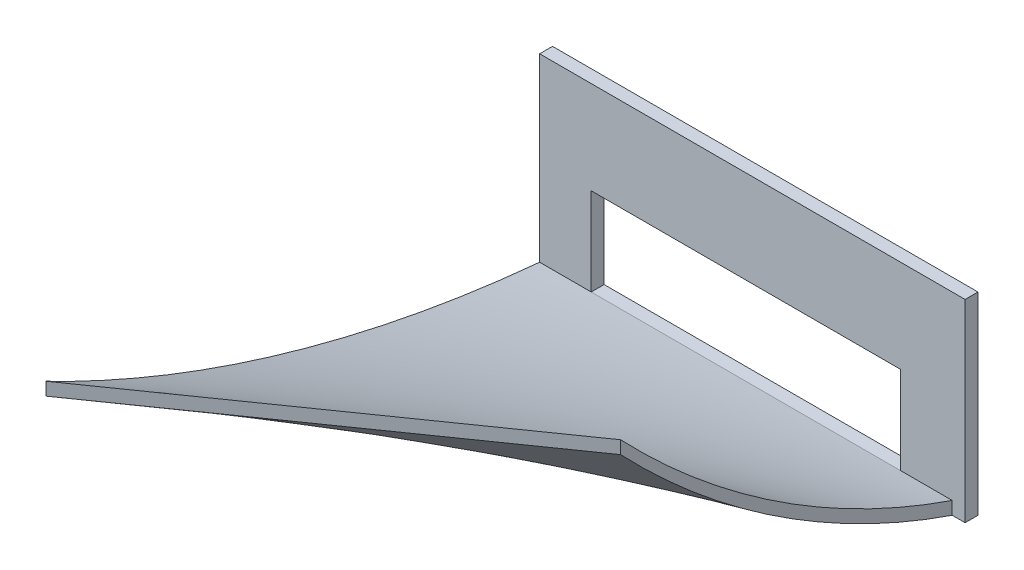
ISO-10303-21;
HEADER;
FILE_DESCRIPTION(('STEP AP214'),'2;1');
FILE_NAME('part.step','',(''),(''),'','','');
FILE_SCHEMA(('AUTOMOTIVE_DESIGN { 1 0 10303 214 1 1 1 1 }'));
ENDSEC;
DATA;
#1=APPLICATION_CONTEXT('core data for automotive mechanical design processes');
#2=APPLICATION_PROTOCOL_DEFINITION('international standard','automotive_design',2000,#1);
#3=PRODUCT_CONTEXT('',#1,'mechanical');
#4=PRODUCT('Part','Part','',(#3));
#5=PRODUCT_RELATED_PRODUCT_CATEGORY('part','',(#4));
#6=PRODUCT_DEFINITION_FORMATION('','',#4);
#7=PRODUCT_DEFINITION_CONTEXT('part definition',#1,'design');
#8=PRODUCT_DEFINITION('design','',#6,#7);
#9=PRODUCT_DEFINITION_SHAPE('','',#8);
#10=(LENGTH_UNIT() NAMED_UNIT(*) SI_UNIT(.MILLI.,.METRE.));
#11=(NAMED_UNIT(*) PLANE_ANGLE_UNIT() SI_UNIT($,.RADIAN.));
#12=(NAMED_UNIT(*) SI_UNIT($,.STERADIAN.) SOLID_ANGLE_UNIT());
#13=UNCERTAINTY_MEASURE_WITH_UNIT(LENGTH_MEASURE(1.E-05),#10,'distance_accuracy_value','');
#14=(GEOMETRIC_REPRESENTATION_CONTEXT(3) GLOBAL_UNCERTAINTY_ASSIGNED_CONTEXT((#13)) GLOBAL_UNIT_ASSIGNED_CONTEXT((#10,
#11,#12)) REPRESENTATION_CONTEXT('',''));
#15=CARTESIAN_POINT('',(0.,0.,0.));
#16=DIRECTION('',(0.,0.,1.));
#17=DIRECTION('',(1.,0.,0.));
#18=AXIS2_PLACEMENT_3D('',#15,#16,#17);
#19=CARTESIAN_POINT('',(-50.8,22.225,3.175));
#20=DIRECTION('',(0.,-1.,0.));
#21=DIRECTION('',(0.,0.,-1.));
#22=AXIS2_PLACEMENT_3D('',#19,#20,#21);
#23=PLANE('',#22);
#24=DIRECTION('',(-1.,0.,0.));
#25=VECTOR('',#24,1.);
#26=CARTESIAN_POINT('',(-50.8,22.225,0.));
#27=LINE('',#26,#25);
#28=CARTESIAN_POINT('',(53.975,22.225,0.));
#29=VERTEX_POINT('',#28);
#30=CARTESIAN_POINT('',(-50.8,22.225,0.));
#31=VERTEX_POINT('',#30);
#32=EDGE_CURVE('E224',#29,#31,#27,.T.);
#33=ORIENTED_EDGE('',*,*,#32,.T.);
#34=DIRECTION('',(0.,0.,-1.));
#35=VECTOR('',#34,1.);
#36=CARTESIAN_POINT('',(-50.8,22.225,3.175));
#37=LINE('',#36,#35);
#38=CARTESIAN_POINT('',(-50.8,22.225,3.175));
#39=VERTEX_POINT('',#38);
#40=EDGE_CURVE('E107',#39,#31,#37,.T.);
#41=ORIENTED_EDGE('',*,*,#40,.F.);
#42=DIRECTION('',(-1.,0.,0.));
#43=VECTOR('',#42,1.);
#44=CARTESIAN_POINT('',(-50.8,22.225,3.175));
#45=LINE('',#44,#43);
#46=CARTESIAN_POINT('',(53.975,22.225,3.175));
#47=VERTEX_POINT('',#46);
#48=EDGE_CURVE('E150',#47,#39,#45,.T.);
#49=ORIENTED_EDGE('',*,*,#48,.F.);
#50=DIRECTION('',(0.,0.,1.));
#51=VECTOR('',#50,1.);
#52=CARTESIAN_POINT('',(53.975,22.225,3.175));
#53=LINE('',#52,#51);
#54=EDGE_CURVE('E324',#29,#47,#53,.T.);
#55=ORIENTED_EDGE('',*,*,#54,.F.);
#56=EDGE_LOOP('',(#33,#41,#49,#55));
#57=FACE_BOUND('',#56,.T.);
#58=ADVANCED_FACE('F97',(#57),#23,.F.);
#59=CARTESIAN_POINT('',(-50.8,-22.225,3.175));
#60=DIRECTION('',(1.,0.,0.));
#61=DIRECTION('',(0.,0.,-1.));
#62=AXIS2_PLACEMENT_3D('',#59,#60,#61);
#63=PLANE('',#62);
#64=DIRECTION('',(0.,-1.,0.));
#65=VECTOR('',#64,1.);
#66=CARTESIAN_POINT('',(-50.8,-22.225,0.));
#67=LINE('',#66,#65);
#68=CARTESIAN_POINT('',(-50.8,-25.4,0.));
#69=VERTEX_POINT('',#68);
#70=EDGE_CURVE('E226',#31,#69,#67,.T.);
#71=ORIENTED_EDGE('',*,*,#70,.T.);
#72=DIRECTION('',(0.,0.,1.));
#73=VECTOR('',#72,1.);
#74=CARTESIAN_POINT('',(-50.8,-25.4,0.));
#75=LINE('',#74,#73);
#76=CARTESIAN_POINT('',(-50.8,-25.4000000000005,3.175));
#77=VERTEX_POINT('',#76);
#78=EDGE_CURVE('E236',#69,#77,#75,.T.);
#79=ORIENTED_EDGE('',*,*,#78,.T.);
#80=DIRECTION('',(0.,-1.,0.));
#81=VECTOR('',#80,1.);
#82=CARTESIAN_POINT('',(-50.8,-25.4,3.175));
#83=LINE('',#82,#81);
#84=CARTESIAN_POINT('',(-50.8,-22.225,3.175));
#85=VERTEX_POINT('',#84);
#86=EDGE_CURVE('E141',#85,#77,#83,.T.);
#87=ORIENTED_EDGE('',*,*,#86,.F.);
#88=DIRECTION('',(0.,-1.,0.));
#89=VECTOR('',#88,1.);
#90=CARTESIAN_POINT('',(-50.8,-22.225,3.175));
#91=LINE('',#90,#89);
#92=EDGE_CURVE('E238',#39,#85,#91,.T.);
#93=ORIENTED_EDGE('',*,*,#92,.F.);
#94=ORIENTED_EDGE('',*,*,#40,.T.);
#95=EDGE_LOOP('',(#71,#79,#87,#93,#94));
#96=FACE_BOUND('',#95,.T.);
#97=ADVANCED_FACE('F284',(#96),#63,.F.);
#98=CARTESIAN_POINT('',(-38.1,-22.225,3.175));
#99=DIRECTION('',(-1.,0.,0.));
#100=DIRECTION('',(0.,0.,1.));
#101=AXIS2_PLACEMENT_3D('',#98,#99,#100);
#102=PLANE('',#101);
#103=DIRECTION('',(0.,1.,0.));
#104=VECTOR('',#103,1.);
#105=CARTESIAN_POINT('',(-38.1,-22.225,0.));
#106=LINE('',#105,#104);
#107=CARTESIAN_POINT('',(-38.1,-22.225,0.));
#108=VERTEX_POINT('',#107);
#109=CARTESIAN_POINT('',(-38.1,-0.635000000000004,0.));
#110=VERTEX_POINT('',#109);
#111=EDGE_CURVE('E222',#108,#110,#106,.T.);
#112=ORIENTED_EDGE('',*,*,#111,.T.);
#113=DIRECTION('',(0.,0.,-1.));
#114=VECTOR('',#113,1.);
#115=CARTESIAN_POINT('',(-38.1,-0.635000000000004,3.175));
#116=LINE('',#115,#114);
#117=CARTESIAN_POINT('',(-38.1,-0.635000000000004,3.175));
#118=VERTEX_POINT('',#117);
#119=EDGE_CURVE('E248',#118,#110,#116,.T.);
#120=ORIENTED_EDGE('',*,*,#119,.F.);
#121=DIRECTION('',(0.,1.,0.));
#122=VECTOR('',#121,1.);
#123=CARTESIAN_POINT('',(-38.1,-22.225,3.175));
#124=LINE('',#123,#122);
#125=CARTESIAN_POINT('',(-38.1,-22.225,3.175));
#126=VERTEX_POINT('',#125);
#127=EDGE_CURVE('E241',#126,#118,#124,.T.);
#128=ORIENTED_EDGE('',*,*,#127,.F.);
#129=DIRECTION('',(0.,0.,-1.));
#130=VECTOR('',#129,1.);
#131=CARTESIAN_POINT('',(-38.1,-22.225,3.175));
#132=LINE('',#131,#130);
#133=EDGE_CURVE('E250',#126,#108,#132,.T.);
#134=ORIENTED_EDGE('',*,*,#133,.T.);
#135=EDGE_LOOP('',(#112,#120,#128,#134));
#136=FACE_BOUND('',#135,.T.);
#137=ADVANCED_FACE('F282',(#136),#102,.F.);
#138=CARTESIAN_POINT('',(-38.1,-0.635000000000004,3.175));
#139=DIRECTION('',(0.,1.,0.));
#140=DIRECTION('',(-1.,0.,0.));
#141=AXIS2_PLACEMENT_3D('',#138,#139,#140);
#142=PLANE('',#141);
#143=DIRECTION('',(1.,0.,0.));
#144=VECTOR('',#143,1.);
#145=CARTESIAN_POINT('',(-38.1,-0.635000000000004,0.));
#146=LINE('',#145,#144);
#147=CARTESIAN_POINT('',(38.1,-0.634999999999995,0.));
#148=VERTEX_POINT('',#147);
#149=EDGE_CURVE('E194',#110,#148,#146,.T.);
#150=ORIENTED_EDGE('',*,*,#149,.T.);
#151=DIRECTION('',(0.,0.,-1.));
#152=VECTOR('',#151,1.);
#153=CARTESIAN_POINT('',(38.1,-0.634999999999995,3.175));
#154=LINE('',#153,#152);
#155=CARTESIAN_POINT('',(38.1,-0.634999999999995,3.175));
#156=VERTEX_POINT('',#155);
#157=EDGE_CURVE('E206',#156,#148,#154,.T.);
#158=ORIENTED_EDGE('',*,*,#157,.F.);
#159=DIRECTION('',(1.,0.,0.));
#160=VECTOR('',#159,1.);
#161=CARTESIAN_POINT('',(-38.1,-0.635000000000004,3.175));
#162=LINE('',#161,#160);
#163=EDGE_CURVE('E242',#118,#156,#162,.T.);
#164=ORIENTED_EDGE('',*,*,#163,.F.);
#165=ORIENTED_EDGE('',*,*,#119,.T.);
#166=EDGE_LOOP('',(#150,#158,#164,#165));
#167=FACE_BOUND('',#166,.T.);
#168=ADVANCED_FACE('F279',(#167),#142,.F.);
#169=CARTESIAN_POINT('',(38.1,-22.225,3.175));
#170=DIRECTION('',(1.,0.,0.));
#171=DIRECTION('',(0.,0.,-1.));
#172=AXIS2_PLACEMENT_3D('',#169,#170,#171);
#173=PLANE('',#172);
#174=DIRECTION('',(0.,-1.,0.));
#175=VECTOR('',#174,1.);
#176=CARTESIAN_POINT('',(38.1,-22.225,0.));
#177=LINE('',#176,#175);
#178=CARTESIAN_POINT('',(38.1,-22.225,0.));
#179=VERTEX_POINT('',#178);
#180=EDGE_CURVE('E200',#148,#179,#177,.T.);
#181=ORIENTED_EDGE('',*,*,#180,.T.);
#182=DIRECTION('',(0.,0.,-1.));
#183=VECTOR('',#182,1.);
#184=CARTESIAN_POINT('',(38.1,-22.225,3.175));
#185=LINE('',#184,#183);
#186=CARTESIAN_POINT('',(38.1,-22.225,3.175));
#187=VERTEX_POINT('',#186);
#188=EDGE_CURVE('E204',#187,#179,#185,.T.);
#189=ORIENTED_EDGE('',*,*,#188,.F.);
#190=DIRECTION('',(0.,-1.,0.));
#191=VECTOR('',#190,1.);
#192=CARTESIAN_POINT('',(38.1,-22.225,3.175));
#193=LINE('',#192,#191);
#194=EDGE_CURVE('E218',#156,#187,#193,.T.);
#195=ORIENTED_EDGE('',*,*,#194,.F.);
#196=ORIENTED_EDGE('',*,*,#157,.T.);
#197=EDGE_LOOP('',(#181,#189,#195,#196));
#198=FACE_BOUND('',#197,.T.);
#199=ADVANCED_FACE('F202',(#198),#173,.F.);
#200=CARTESIAN_POINT('',(0.,0.,3.175));
#201=DIRECTION('',(0.,0.,-1.));
#202=DIRECTION('',(-1.,0.,0.));
#203=AXIS2_PLACEMENT_3D('',#200,#201,#202);
#204=PLANE('',#203);
#205=ORIENTED_EDGE('',*,*,#92,.T.);
#206=DIRECTION('',(-1.,0.,0.));
#207=VECTOR('',#206,1.);
#208=CARTESIAN_POINT('',(0.,-22.225,3.175));
#209=LINE('',#208,#207);
#210=EDGE_CURVE('E13',#85,#126,#209,.F.);
#211=ORIENTED_EDGE('',*,*,#210,.T.);
#212=ORIENTED_EDGE('',*,*,#127,.T.);
#213=ORIENTED_EDGE('',*,*,#163,.T.);
#214=ORIENTED_EDGE('',*,*,#194,.T.);
#215=DIRECTION('',(-1.,0.,0.));
#216=VECTOR('',#215,1.);
#217=CARTESIAN_POINT('',(-50.8,-22.225,3.175));
#218=LINE('',#217,#216);
#219=CARTESIAN_POINT('',(50.8,-22.225,3.175));
#220=VERTEX_POINT('',#219);
#221=EDGE_CURVE('E100',#220,#187,#218,.T.);
#222=ORIENTED_EDGE('',*,*,#221,.F.);
#223=DIRECTION('',(0.,1.,0.));
#224=VECTOR('',#223,1.);
#225=CARTESIAN_POINT('',(50.8,-22.225,3.175));
#226=LINE('',#225,#224);
#227=CARTESIAN_POINT('',(50.8,-25.4,3.175));
#228=VERTEX_POINT('',#227);
#229=EDGE_CURVE('E209',#228,#220,#226,.T.);
#230=ORIENTED_EDGE('',*,*,#229,.F.);
#231=DIRECTION('',(-1.,0.,0.));
#232=VECTOR('',#231,1.);
#233=CARTESIAN_POINT('',(53.975,-25.4,3.175));
#234=LINE('',#233,#232);
#235=CARTESIAN_POINT('',(53.975,-25.4,3.175));
#236=VERTEX_POINT('',#235);
#237=EDGE_CURVE('E312',#236,#228,#234,.T.);
#238=ORIENTED_EDGE('',*,*,#237,.F.);
#239=DIRECTION('',(0.,-1.,0.));
#240=VECTOR('',#239,1.);
#241=CARTESIAN_POINT('',(53.975,22.225,3.175));
#242=LINE('',#241,#240);
#243=EDGE_CURVE('E592',#47,#236,#242,.T.);
#244=ORIENTED_EDGE('',*,*,#243,.F.);
#245=ORIENTED_EDGE('',*,*,#48,.T.);
#246=EDGE_LOOP('',(#205,#211,#212,#213,#214,#222,#230,#238,#244,#245));
#247=FACE_BOUND('',#246,.T.);
#248=ADVANCED_FACE('F263',(#247),#204,.F.);
#249=CARTESIAN_POINT('',(0.,0.,0.));
#250=DIRECTION('',(0.,0.,-1.));
#251=DIRECTION('',(-1.,0.,0.));
#252=AXIS2_PLACEMENT_3D('',#249,#250,#251);
#253=PLANE('',#252);
#254=ORIENTED_EDGE('',*,*,#111,.F.);
#255=DIRECTION('',(-1.,0.,0.));
#256=VECTOR('',#255,1.);
#257=CARTESIAN_POINT('',(55.2901280605346,-22.225,0.));
#258=LINE('',#257,#256);
#259=EDGE_CURVE('E215',#179,#108,#258,.T.);
#260=ORIENTED_EDGE('',*,*,#259,.F.);
#261=ORIENTED_EDGE('',*,*,#180,.F.);
#262=ORIENTED_EDGE('',*,*,#149,.F.);
#263=EDGE_LOOP('',(#254,#260,#261,#262));
#264=FACE_BOUND('',#263,.T.);
#265=ORIENTED_EDGE('',*,*,#32,.F.);
#266=DIRECTION('',(0.,1.,0.));
#267=VECTOR('',#266,1.);
#268=CARTESIAN_POINT('',(53.975,22.225,0.));
#269=LINE('',#268,#267);
#270=CARTESIAN_POINT('',(53.975,-25.4,0.));
#271=VERTEX_POINT('',#270);
#272=EDGE_CURVE('E298',#271,#29,#269,.T.);
#273=ORIENTED_EDGE('',*,*,#272,.F.);
#274=DIRECTION('',(-1.,0.,0.));
#275=VECTOR('',#274,1.);
#276=CARTESIAN_POINT('',(55.2901280605346,-25.4,0.));
#277=LINE('',#276,#275);
#278=EDGE_CURVE('E233',#271,#69,#277,.T.);
#279=ORIENTED_EDGE('',*,*,#278,.T.);
#280=ORIENTED_EDGE('',*,*,#70,.F.);
#281=EDGE_LOOP('',(#265,#273,#279,#280));
#282=FACE_BOUND('',#281,.T.);
#283=ADVANCED_FACE('F220',(#264,#282),#253,.T.);
#284=CARTESIAN_POINT('',(55.2901280605346,-22.225,0.));
#285=DIRECTION('',(0.,1.,0.));
#286=DIRECTION('',(0.,0.,1.));
#287=AXIS2_PLACEMENT_3D('',#284,#285,#286);
#288=PLANE('',#287);
#289=ORIENTED_EDGE('',*,*,#133,.F.);
#290=CARTESIAN_POINT('',(50.8,-22.225,3.175));
#291=CARTESIAN_POINT('',(42.3333333333333,-22.225,3.175));
#292=CARTESIAN_POINT('',(25.4,-22.225,3.175));
#293=CARTESIAN_POINT('',(0.,-22.225,3.175));
#294=CARTESIAN_POINT('',(-25.4,-22.225,3.175));
#295=CARTESIAN_POINT('',(-42.3333333333333,-22.225,3.175));
#296=CARTESIAN_POINT('',(-50.8,-22.225,3.175));
#297=B_SPLINE_CURVE_WITH_KNOTS('',3,(#290,#291,#292,#293,#294,#295,#296),.UNSPECIFIED.,.F.,.F.,
(4,1,1,1,4),(0.515151515151515,0.636363636363636,0.757575757575758,0.878787878787879,1.),.UNSPECIFIED.);
#298=EDGE_CURVE('E216',#187,#126,#297,.T.);
#299=ORIENTED_EDGE('',*,*,#298,.F.);
#300=ORIENTED_EDGE('',*,*,#188,.T.);
#301=ORIENTED_EDGE('',*,*,#259,.T.);
#302=EDGE_LOOP('',(#289,#299,#300,#301));
#303=FACE_BOUND('',#302,.T.);
#304=ADVANCED_FACE('F214',(#303),#288,.T.);
#305=CARTESIAN_POINT('',(55.2901280605346,-25.4,0.));
#306=DIRECTION('',(0.,-1.,0.));
#307=DIRECTION('',(0.,0.,-1.));
#308=AXIS2_PLACEMENT_3D('',#305,#306,#307);
#309=PLANE('',#308);
#310=ORIENTED_EDGE('',*,*,#278,.F.);
#311=DIRECTION('',(0.,0.,-1.));
#312=VECTOR('',#311,1.);
#313=CARTESIAN_POINT('',(53.975,-25.4,3.175));
#314=LINE('',#313,#312);
#315=EDGE_CURVE('E322',#236,#271,#314,.T.);
#316=ORIENTED_EDGE('',*,*,#315,.F.);
#317=ORIENTED_EDGE('',*,*,#237,.T.);
#318=DIRECTION('',(1.,0.,0.));
#319=VECTOR('',#318,1.);
#320=CARTESIAN_POINT('',(55.2901280605346,-25.4,3.175));
#321=LINE('',#320,#319);
#322=EDGE_CURVE('E228',#228,#77,#321,.F.);
#323=ORIENTED_EDGE('',*,*,#322,.T.);
#324=ORIENTED_EDGE('',*,*,#78,.F.);
#325=EDGE_LOOP('',(#310,#316,#317,#323,#324));
#326=FACE_BOUND('',#325,.T.);
#327=ADVANCED_FACE('F273',(#326),#309,.T.);
#328=CARTESIAN_POINT('',(49.2281471714218,0.,70.3050802584733));
#329=DIRECTION('',(-0.573576436351047,0.,-0.819152044288991));
#330=DIRECTION('',(-0.819152044288991,0.,0.573576436351047));
#331=AXIS2_PLACEMENT_3D('',#328,#329,#330);
#332=PLANE('',#331);
#333=DIRECTION('',(-0.819152044288991,0.,0.573576436351047));
#334=VECTOR('',#333,1.);
#335=CARTESIAN_POINT('',(-41.6129238498808,22.352,133.912682966633));
#336=LINE('',#335,#334);
#337=CARTESIAN_POINT('',(41.6129238498807,22.352,75.6373170333668));
#338=VERTEX_POINT('',#337);
#339=CARTESIAN_POINT('',(-41.6129238498808,22.352,133.912682966633));
#340=VERTEX_POINT('',#339);
#341=EDGE_CURVE('E399',#338,#340,#336,.T.);
#342=ORIENTED_EDGE('',*,*,#341,.T.);
#343=DIRECTION('',(0.,-1.,0.));
#344=VECTOR('',#343,1.);
#345=CARTESIAN_POINT('',(-41.6129238498808,22.352,133.912682966633));
#346=LINE('',#345,#344);
#347=CARTESIAN_POINT('',(-41.6129238498808,19.177,133.912682966633));
#348=VERTEX_POINT('',#347);
#349=EDGE_CURVE('E304',#340,#348,#346,.T.);
#350=ORIENTED_EDGE('',*,*,#349,.T.);
#351=DIRECTION('',(0.819152044288991,0.,-0.573576436351047));
#352=VECTOR('',#351,1.);
#353=CARTESIAN_POINT('',(-41.6129238498808,19.177,133.912682966633));
#354=LINE('',#353,#352);
#355=CARTESIAN_POINT('',(41.6129238498807,19.177,75.6373170333668));
#356=VERTEX_POINT('',#355);
#357=EDGE_CURVE('E306',#348,#356,#354,.T.);
#358=ORIENTED_EDGE('',*,*,#357,.T.);
#359=DIRECTION('',(0.,1.,0.));
#360=VECTOR('',#359,1.);
#361=CARTESIAN_POINT('',(41.6129238498807,22.352,75.6373170333668));
#362=LINE('',#361,#360);
#363=EDGE_CURVE('E420',#356,#338,#362,.T.);
#364=ORIENTED_EDGE('',*,*,#363,.T.);
#365=EDGE_LOOP('',(#342,#350,#358,#364));
#366=FACE_BOUND('',#365,.T.);
#367=ADVANCED_FACE('F373',(#366),#332,.F.);
#368=CARTESIAN_POINT('',(50.8,-22.225,3.175));
#369=CARTESIAN_POINT('',(47.8087785558894,-15.1300790755062,29.5963695507567));
#370=CARTESIAN_POINT('',(44.7934284452666,-0.0429866335637085,54.4194362928109));
#371=CARTESIAN_POINT('',(41.6129238498807,22.352,75.6373170333668));
#372=CARTESIAN_POINT('',(42.3333333333333,-22.225,3.175));
#373=CARTESIAN_POINT('',(39.8525050086738,-15.1300790755062,31.2151297155696));
#374=CARTESIAN_POINT('',(37.3475480175021,-0.0429866335637085,57.6569566224368));
#375=CARTESIAN_POINT('',(34.6774365415673,22.352,80.4935975278057));
#376=CARTESIAN_POINT('',(25.4,-22.225,3.175));
#377=CARTESIAN_POINT('',(23.9399579142426,-15.1300790755062,34.4526500451955));
#378=CARTESIAN_POINT('',(22.455787161973,-0.0429866335636903,64.1319972816887));
#379=CARTESIAN_POINT('',(20.8064619249403,22.352,90.2061585166834));
#380=CARTESIAN_POINT('',(0.,-22.225,3.175));
#381=CARTESIAN_POINT('',(0.0711372725958545,-15.1300790755062,39.3089305396344));
#382=CARTESIAN_POINT('',(0.118145878679511,-0.0429866335637397,73.8445582705664));
#383=CARTESIAN_POINT('',(0.,22.352,104.775));
#384=CARTESIAN_POINT('',(-25.4,-22.225,3.175));
#385=CARTESIAN_POINT('',(-23.797683369051,-15.1300790755062,44.1652110340733));
#386=CARTESIAN_POINT('',(-22.2194954046141,-0.0429866335637024,83.5571192594441));
#387=CARTESIAN_POINT('',(-20.8064619249404,22.352,119.343841483317));
#388=CARTESIAN_POINT('',(-42.3333333333333,-22.225,3.175));
#389=CARTESIAN_POINT('',(-39.7102304634822,-15.1300790755062,47.4027313636992));
#390=CARTESIAN_POINT('',(-37.1112562601431,-0.0429866335637215,90.032159918696));
#391=CARTESIAN_POINT('',(-34.6774365415673,22.352,129.056402472194));
#392=CARTESIAN_POINT('',(-50.8,-22.225,3.175));
#393=CARTESIAN_POINT('',(-47.6665040106978,-15.1300790755062,49.0214915285121));
#394=CARTESIAN_POINT('',(-44.5571366879077,-0.0429866335637241,93.2696802483218));
#395=CARTESIAN_POINT('',(-41.6129238498808,22.352,133.912682966633));
#396=B_SPLINE_SURFACE_WITH_KNOTS('',3,3,((#368,#369,#370,#371),(#372,#373,#374,#375),(#376,#377,
#378,#379),(#380,#381,#382,#383),(#384,#385,#386,#387),(#388,#389,#390,#391),(#392,#393,#394,
#395)),.UNSPECIFIED.,.F.,.F.,.F.,(4,1,1,1,4),(4,4),(0.515151515151515,0.636363636363636,
0.757575757575758,0.878787878787879,1.),(0.,1.),.UNSPECIFIED.);
#397=CARTESIAN_POINT('',(-50.8,-22.225,3.175));
#398=CARTESIAN_POINT('',(-47.6665040106978,-15.1300790755062,49.0214915285121));
#399=CARTESIAN_POINT('',(-44.5571366879077,-0.0429866335637241,93.2696802483218));
#400=CARTESIAN_POINT('',(-41.6129238498808,22.352,133.912682966633));
#401=B_SPLINE_CURVE_WITH_KNOTS('',3,(#397,#398,#399,#400),.UNSPECIFIED.,.F.,.F.,(4,4),(0.,1.),.UNSPECIFIED.);
#402=EDGE_CURVE('E347',#85,#340,#401,.T.);
#403=CARTESIAN_POINT('',(50.8,-22.225,3.175));
#404=CARTESIAN_POINT('',(47.8087785558894,-15.1300790755062,29.5963695507567));
#405=CARTESIAN_POINT('',(44.7934284452666,-0.0429866335637085,54.4194362928109));
#406=CARTESIAN_POINT('',(41.6129238498807,22.352,75.6373170333668));
#407=B_SPLINE_CURVE_WITH_KNOTS('',3,(#403,#404,#405,#406),.UNSPECIFIED.,.F.,.F.,(4,4),(0.,1.),.UNSPECIFIED.);
#408=EDGE_CURVE('E116',#220,#338,#407,.T.);
#409=ORIENTED_EDGE('',*,*,#221,.T.);
#410=ORIENTED_EDGE('',*,*,#298,.T.);
#411=ORIENTED_EDGE('',*,*,#210,.F.);
#412=ORIENTED_EDGE('',*,*,#402,.T.);
#413=ORIENTED_EDGE('',*,*,#341,.F.);
#414=ORIENTED_EDGE('',*,*,#408,.F.);
#415=EDGE_LOOP('',(#409,#410,#411,#412,#413,#414));
#416=FACE_BOUND('',#415,.T.);
#417=ADVANCED_FACE('F361',(#416),#396,.T.);
#418=CARTESIAN_POINT('',(50.8,-25.4,3.175));
#419=CARTESIAN_POINT('',(47.8087785558894,-18.3050790755062,29.5963695507566));
#420=CARTESIAN_POINT('',(44.7934284452667,-3.21798663356371,54.4194362928109));
#421=CARTESIAN_POINT('',(41.6129238498807,19.177,75.6373170333668));
#422=CARTESIAN_POINT('',(50.8,-25.1354166666667,3.175));
#423=CARTESIAN_POINT('',(47.8087785558894,-18.0404957421728,29.5963695507566));
#424=CARTESIAN_POINT('',(44.7934284452667,-2.95340330023038,54.4194362928109));
#425=CARTESIAN_POINT('',(41.6129238498807,19.4415833333333,75.6373170333668));
#426=CARTESIAN_POINT('',(50.8,-24.60625,3.175));
#427=CARTESIAN_POINT('',(47.8087785558894,-17.5113290755062,29.5963695507566));
#428=CARTESIAN_POINT('',(44.7934284452666,-2.4242366335637,54.4194362928109));
#429=CARTESIAN_POINT('',(41.6129238498807,19.97075,75.6373170333668));
#430=CARTESIAN_POINT('',(50.8,-23.8125,3.175));
#431=CARTESIAN_POINT('',(47.8087785558894,-16.7175790755062,29.5963695507567));
#432=CARTESIAN_POINT('',(44.7934284452667,-1.63048663356373,54.419436292811));
#433=CARTESIAN_POINT('',(41.6129238498807,20.7645,75.6373170333669));
#434=CARTESIAN_POINT('',(50.8,-23.01875,3.175));
#435=CARTESIAN_POINT('',(47.8087785558894,-15.9238290755062,29.5963695507566));
#436=CARTESIAN_POINT('',(44.7934284452667,-0.836736633563704,54.4194362928109));
#437=CARTESIAN_POINT('',(41.6129238498807,21.55825,75.6373170333667));
#438=CARTESIAN_POINT('',(50.8,-22.4895833333333,3.175));
#439=CARTESIAN_POINT('',(47.8087785558894,-15.3946624088395,29.5963695507566));
#440=CARTESIAN_POINT('',(44.7934284452667,-0.30756996689704,54.4194362928109));
#441=CARTESIAN_POINT('',(41.6129238498807,22.0874166666667,75.6373170333668));
#442=CARTESIAN_POINT('',(50.8,-22.225,3.175));
#443=CARTESIAN_POINT('',(47.8087785558894,-15.1300790755062,29.5963695507567));
#444=CARTESIAN_POINT('',(44.7934284452666,-0.0429866335637085,54.4194362928109));
#445=CARTESIAN_POINT('',(41.6129238498807,22.352,75.6373170333668));
#446=B_SPLINE_SURFACE_WITH_KNOTS('',3,3,((#418,#419,#420,#421),(#422,#423,#424,#425),(#426,#427,
#428,#429),(#430,#431,#432,#433),(#434,#435,#436,#437),(#438,#439,#440,#441),(#442,#443,#444,
#445)),.UNSPECIFIED.,.F.,.F.,.F.,(4,1,1,1,4),(4,4),(0.5,0.503787878787879,0.507575757575758,
0.511363636363636,0.515151515151515),(0.,1.),.UNSPECIFIED.);
#447=CARTESIAN_POINT('',(50.8,-25.4,3.175));
#448=CARTESIAN_POINT('',(47.8087785558894,-18.3050790755062,29.5963695507566));
#449=CARTESIAN_POINT('',(44.7934284452667,-3.21798663356371,54.4194362928109));
#450=CARTESIAN_POINT('',(41.6129238498807,19.177,75.6373170333668));
#451=B_SPLINE_CURVE_WITH_KNOTS('',3,(#447,#448,#449,#450),.UNSPECIFIED.,.F.,.F.,(4,4),(0.,1.),.UNSPECIFIED.);
#452=EDGE_CURVE('E133',#228,#356,#451,.T.);
#453=ORIENTED_EDGE('',*,*,#229,.T.);
#454=ORIENTED_EDGE('',*,*,#408,.T.);
#455=ORIENTED_EDGE('',*,*,#363,.F.);
#456=ORIENTED_EDGE('',*,*,#452,.F.);
#457=EDGE_LOOP('',(#453,#454,#455,#456));
#458=FACE_BOUND('',#457,.T.);
#459=ADVANCED_FACE('F318',(#458),#446,.T.);
#460=CARTESIAN_POINT('',(-50.8,-25.4,3.175));
#461=CARTESIAN_POINT('',(-47.6665040106978,-18.3050790755062,49.0214915285121));
#462=CARTESIAN_POINT('',(-44.5571366879077,-3.21798663356373,93.2696802483218));
#463=CARTESIAN_POINT('',(-41.6129238498807,19.177,133.912682966633));
#464=CARTESIAN_POINT('',(-42.3333333333333,-25.4,3.175));
#465=CARTESIAN_POINT('',(-39.7102304634821,-18.3050790755062,47.4027313636992));
#466=CARTESIAN_POINT('',(-37.1112562601431,-3.21798663356373,90.0321599186959));
#467=CARTESIAN_POINT('',(-34.6774365415673,19.177,129.056402472194));
#468=CARTESIAN_POINT('',(-25.4,-25.4,3.175));
#469=CARTESIAN_POINT('',(-23.797683369051,-18.3050790755062,44.1652110340732));
#470=CARTESIAN_POINT('',(-22.2194954046141,-3.21798663356371,83.557119259444));
#471=CARTESIAN_POINT('',(-20.8064619249404,19.177,119.343841483316));
#472=CARTESIAN_POINT('',(0.,-25.4,3.175));
#473=CARTESIAN_POINT('',(0.0711372725958123,-18.3050790755062,39.3089305396344));
#474=CARTESIAN_POINT('',(0.118145878679479,-3.21798663356374,73.8445582705665));
#475=CARTESIAN_POINT('',(0.,19.177,104.775));
#476=CARTESIAN_POINT('',(25.4,-25.4,3.175));
#477=CARTESIAN_POINT('',(23.9399579142426,-18.3050790755062,34.4526500451955));
#478=CARTESIAN_POINT('',(22.4557871619731,-3.2179866335637,64.1319972816886));
#479=CARTESIAN_POINT('',(20.8064619249403,19.177,90.2061585166833));
#480=CARTESIAN_POINT('',(42.3333333333333,-25.4,3.175));
#481=CARTESIAN_POINT('',(39.8525050086738,-18.3050790755062,31.2151297155696));
#482=CARTESIAN_POINT('',(37.3475480175021,-3.21798663356371,57.6569566224368));
#483=CARTESIAN_POINT('',(34.6774365415672,19.177,80.4935975278057));
#484=CARTESIAN_POINT('',(50.8,-25.4,3.175));
#485=CARTESIAN_POINT('',(47.8087785558894,-18.3050790755062,29.5963695507566));
#486=CARTESIAN_POINT('',(44.7934284452667,-3.21798663356371,54.4194362928109));
#487=CARTESIAN_POINT('',(41.6129238498807,19.177,75.6373170333668));
#488=B_SPLINE_SURFACE_WITH_KNOTS('',3,3,((#460,#461,#462,#463),(#464,#465,#466,#467),(#468,#469,
#470,#471),(#472,#473,#474,#475),(#476,#477,#478,#479),(#480,#481,#482,#483),(#484,#485,#486,
#487)),.UNSPECIFIED.,.F.,.F.,.F.,(4,1,1,1,4),(4,4),(0.0151515151515152,0.136363636363636,
0.257575757575757,0.378787878787879,0.5),(0.,1.),.UNSPECIFIED.);
#489=CARTESIAN_POINT('',(-50.8,-25.4,3.175));
#490=CARTESIAN_POINT('',(-47.6665040106978,-18.3050790755062,49.0214915285121));
#491=CARTESIAN_POINT('',(-44.5571366879077,-3.21798663356373,93.2696802483218));
#492=CARTESIAN_POINT('',(-41.6129238498807,19.177,133.912682966633));
#493=B_SPLINE_CURVE_WITH_KNOTS('',3,(#489,#490,#491,#492),.UNSPECIFIED.,.F.,.F.,(4,4),(0.,1.),.UNSPECIFIED.);
#494=EDGE_CURVE('E329',#77,#348,#493,.T.);
#495=ORIENTED_EDGE('',*,*,#322,.F.);
#496=ORIENTED_EDGE('',*,*,#452,.T.);
#497=ORIENTED_EDGE('',*,*,#357,.F.);
#498=ORIENTED_EDGE('',*,*,#494,.F.);
#499=EDGE_LOOP('',(#495,#496,#497,#498));
#500=FACE_BOUND('',#499,.T.);
#501=ADVANCED_FACE('F457',(#500),#488,.T.);
#502=CARTESIAN_POINT('',(-50.8,-22.225,3.175));
#503=CARTESIAN_POINT('',(-47.6665040106978,-15.1300790755062,49.0214915285121));
#504=CARTESIAN_POINT('',(-44.5571366879077,-0.0429866335637241,93.2696802483218));
#505=CARTESIAN_POINT('',(-41.6129238498808,22.352,133.912682966633));
#506=CARTESIAN_POINT('',(-50.8,-22.4895833333333,3.175));
#507=CARTESIAN_POINT('',(-47.6665040106978,-15.3946624088395,49.0214915285121));
#508=CARTESIAN_POINT('',(-44.5571366879077,-0.30756996689706,93.2696802483218));
#509=CARTESIAN_POINT('',(-41.6129238498808,22.0874166666666,133.912682966633));
#510=CARTESIAN_POINT('',(-50.8,-23.01875,3.175));
#511=CARTESIAN_POINT('',(-47.6665040106977,-15.9238290755062,49.0214915285121));
#512=CARTESIAN_POINT('',(-44.5571366879076,-0.836736633563734,93.2696802483218));
#513=CARTESIAN_POINT('',(-41.6129238498807,21.55825,133.912682966633));
#514=CARTESIAN_POINT('',(-50.8,-23.8125,3.175));
#515=CARTESIAN_POINT('',(-47.6665040106978,-16.7175790755062,49.0214915285122));
#516=CARTESIAN_POINT('',(-44.5571366879077,-1.63048663356371,93.2696802483219));
#517=CARTESIAN_POINT('',(-41.6129238498808,20.7645,133.912682966633));
#518=CARTESIAN_POINT('',(-50.8,-24.60625,3.175));
#519=CARTESIAN_POINT('',(-47.6665040106977,-17.5113290755062,49.0214915285121));
#520=CARTESIAN_POINT('',(-44.5571366879076,-2.42423663356374,93.2696802483217));
#521=CARTESIAN_POINT('',(-41.6129238498807,19.97075,133.912682966633));
#522=CARTESIAN_POINT('',(-50.8,-25.1354166666667,3.175));
#523=CARTESIAN_POINT('',(-47.6665040106978,-18.0404957421729,49.0214915285121));
#524=CARTESIAN_POINT('',(-44.5571366879077,-2.95340330023039,93.2696802483218));
#525=CARTESIAN_POINT('',(-41.6129238498808,19.4415833333333,133.912682966633));
#526=CARTESIAN_POINT('',(-50.8,-25.4,3.175));
#527=CARTESIAN_POINT('',(-47.6665040106978,-18.3050790755062,49.0214915285121));
#528=CARTESIAN_POINT('',(-44.5571366879077,-3.21798663356373,93.2696802483218));
#529=CARTESIAN_POINT('',(-41.6129238498807,19.177,133.912682966633));
#530=B_SPLINE_SURFACE_WITH_KNOTS('',3,3,((#502,#503,#504,#505),(#506,#507,#508,#509),(#510,#511,
#512,#513),(#514,#515,#516,#517),(#518,#519,#520,#521),(#522,#523,#524,#525),(#526,#527,#528,
#529)),.UNSPECIFIED.,.F.,.F.,.F.,(4,1,1,1,4),(4,4),(0.,0.0037878787878788,0.00757575757575759,
0.0113636363636364,0.0151515151515152),(0.,1.),.UNSPECIFIED.);
#531=ORIENTED_EDGE('',*,*,#86,.T.);
#532=ORIENTED_EDGE('',*,*,#494,.T.);
#533=ORIENTED_EDGE('',*,*,#349,.F.);
#534=ORIENTED_EDGE('',*,*,#402,.F.);
#535=EDGE_LOOP('',(#531,#532,#533,#534));
#536=FACE_BOUND('',#535,.T.);
#537=ADVANCED_FACE('F436',(#536),#530,.T.);
#538=CARTESIAN_POINT('',(53.975,0.,0.));
#539=DIRECTION('',(1.,0.,0.));
#540=DIRECTION('',(0.,0.,-1.));
#541=AXIS2_PLACEMENT_3D('',#538,#539,#540);
#542=PLANE('',#541);
#543=ORIENTED_EDGE('',*,*,#243,.T.);
#544=ORIENTED_EDGE('',*,*,#315,.T.);
#545=ORIENTED_EDGE('',*,*,#272,.T.);
#546=ORIENTED_EDGE('',*,*,#54,.T.);
#547=EDGE_LOOP('',(#543,#544,#545,#546));
#548=FACE_BOUND('',#547,.T.);
#549=ADVANCED_FACE('F456',(#548),#542,.T.);
#550=CLOSED_SHELL('',(#58,#97,#137,#168,#199,#248,#283,#304,#327,#367,#417,#459,#501,#537,#549));
#551=MANIFOLD_SOLID_BREP('B2',#550);
#552=ADVANCED_BREP_SHAPE_REPRESENTATION('',(#18,#551),#14);
#553=SHAPE_DEFINITION_REPRESENTATION(#9,#552);
ENDSEC;
END-ISO-10303-21;
